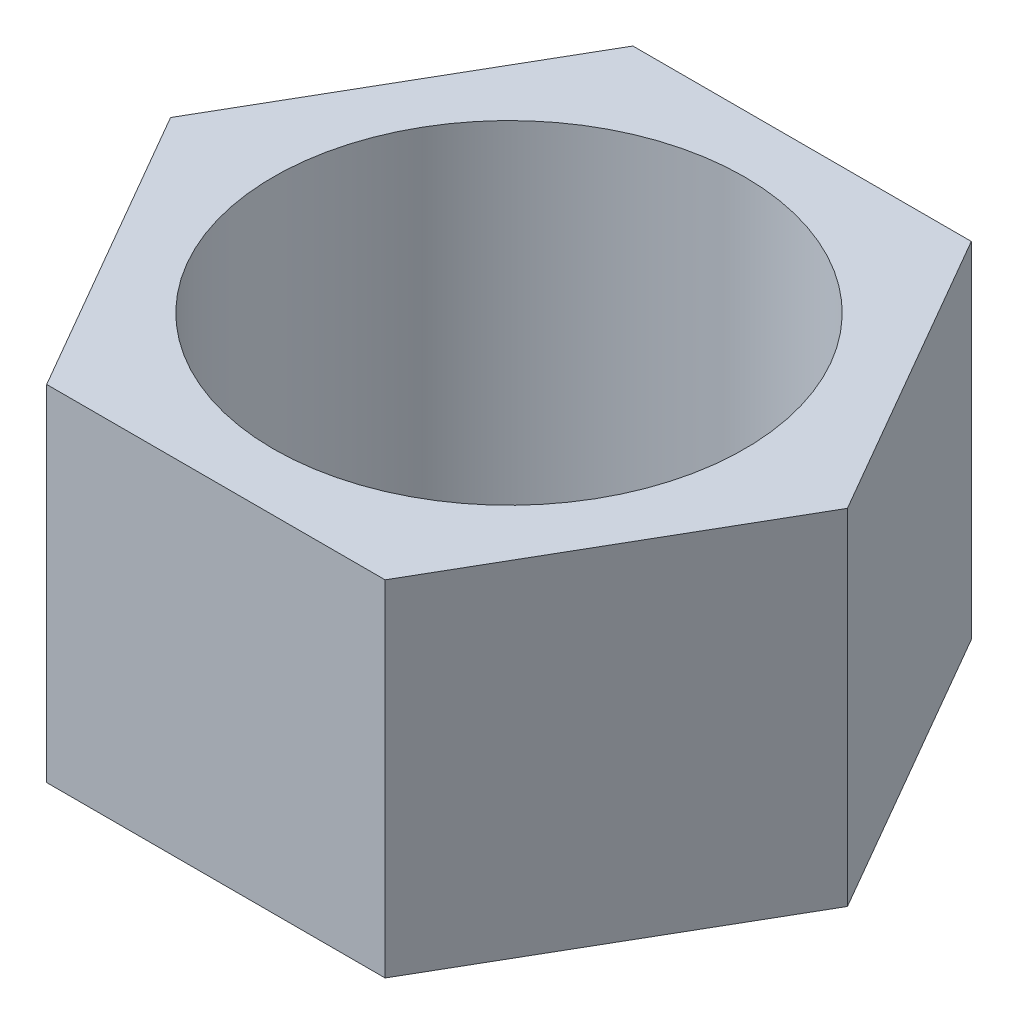
ISO-10303-21;
HEADER;
FILE_DESCRIPTION(('STEP AP214'),'2;1');
FILE_NAME('part.step','',(''),(''),'','','');
FILE_SCHEMA(('AUTOMOTIVE_DESIGN { 1 0 10303 214 1 1 1 1 }'));
ENDSEC;
DATA;
#1=APPLICATION_CONTEXT('core data for automotive mechanical design processes');
#2=APPLICATION_PROTOCOL_DEFINITION('international standard','automotive_design',2000,#1);
#3=PRODUCT_CONTEXT('',#1,'mechanical');
#4=PRODUCT('Part','Part','',(#3));
#5=PRODUCT_RELATED_PRODUCT_CATEGORY('part','',(#4));
#6=PRODUCT_DEFINITION_FORMATION('','',#4);
#7=PRODUCT_DEFINITION_CONTEXT('part definition',#1,'design');
#8=PRODUCT_DEFINITION('design','',#6,#7);
#9=PRODUCT_DEFINITION_SHAPE('','',#8);
#10=(LENGTH_UNIT() NAMED_UNIT(*) SI_UNIT(.MILLI.,.METRE.));
#11=(NAMED_UNIT(*) PLANE_ANGLE_UNIT() SI_UNIT($,.RADIAN.));
#12=(NAMED_UNIT(*) SI_UNIT($,.STERADIAN.) SOLID_ANGLE_UNIT());
#13=UNCERTAINTY_MEASURE_WITH_UNIT(LENGTH_MEASURE(1.E-05),#10,'distance_accuracy_value','');
#14=(GEOMETRIC_REPRESENTATION_CONTEXT(3) GLOBAL_UNCERTAINTY_ASSIGNED_CONTEXT((#13)) GLOBAL_UNIT_ASSIGNED_CONTEXT((#10,
#11,#12)) REPRESENTATION_CONTEXT('',''));
#15=CARTESIAN_POINT('',(0.,0.,0.));
#16=DIRECTION('',(0.,0.,1.));
#17=DIRECTION('',(1.,0.,0.));
#18=AXIS2_PLACEMENT_3D('',#15,#16,#17);
#19=CARTESIAN_POINT('',(0.,7.61999999999996,0.));
#20=DIRECTION('',(0.,1.,0.));
#21=DIRECTION('',(0.,0.,1.));
#22=AXIS2_PLACEMENT_3D('',#19,#20,#21);
#23=PLANE('',#22);
#24=DIRECTION('',(0.5,0.,-0.866025403784439));
#25=VECTOR('',#24,1.);
#26=CARTESIAN_POINT('',(3.7394976935412,7.61999999999996,6.47700000000007));
#27=LINE('',#26,#25);
#28=CARTESIAN_POINT('',(3.7394976935412,7.61999999999996,6.47700000000007));
#29=VERTEX_POINT('',#28);
#30=CARTESIAN_POINT('',(7.47899538708241,7.61999999999996,0.));
#31=VERTEX_POINT('',#30);
#32=EDGE_CURVE('E294',#29,#31,#27,.T.);
#33=ORIENTED_EDGE('',*,*,#32,.T.);
#34=DIRECTION('',(-0.5,0.,-0.866025403784438));
#35=VECTOR('',#34,1.);
#36=CARTESIAN_POINT('',(7.47899538708241,7.61999999999996,0.));
#37=LINE('',#36,#35);
#38=CARTESIAN_POINT('',(3.7394976935412,7.61999999999996,-6.47700000000007));
#39=VERTEX_POINT('',#38);
#40=EDGE_CURVE('E241',#31,#39,#37,.T.);
#41=ORIENTED_EDGE('',*,*,#40,.T.);
#42=DIRECTION('',(-1.,0.,0.));
#43=VECTOR('',#42,1.);
#44=CARTESIAN_POINT('',(3.7394976935412,7.61999999999996,-6.47700000000007));
#45=LINE('',#44,#43);
#46=CARTESIAN_POINT('',(-3.7394976935412,7.61999999999996,-6.47700000000007));
#47=VERTEX_POINT('',#46);
#48=EDGE_CURVE('E253',#39,#47,#45,.T.);
#49=ORIENTED_EDGE('',*,*,#48,.T.);
#50=DIRECTION('',(-0.5,0.,0.866025403784439));
#51=VECTOR('',#50,1.);
#52=CARTESIAN_POINT('',(-3.7394976935412,7.61999999999996,-6.47700000000007));
#53=LINE('',#52,#51);
#54=CARTESIAN_POINT('',(-7.47899538708241,7.61999999999996,0.));
#55=VERTEX_POINT('',#54);
#56=EDGE_CURVE('E246',#47,#55,#53,.T.);
#57=ORIENTED_EDGE('',*,*,#56,.T.);
#58=DIRECTION('',(0.5,0.,0.866025403784439));
#59=VECTOR('',#58,1.);
#60=CARTESIAN_POINT('',(-7.47899538708241,7.61999999999996,0.));
#61=LINE('',#60,#59);
#62=CARTESIAN_POINT('',(-3.7394976935412,7.61999999999996,6.47700000000007));
#63=VERTEX_POINT('',#62);
#64=EDGE_CURVE('E252',#55,#63,#61,.T.);
#65=ORIENTED_EDGE('',*,*,#64,.T.);
#66=DIRECTION('',(1.,0.,0.));
#67=VECTOR('',#66,1.);
#68=CARTESIAN_POINT('',(-3.7394976935412,7.61999999999996,6.47700000000007));
#69=LINE('',#68,#67);
#70=EDGE_CURVE('E204',#63,#29,#69,.T.);
#71=ORIENTED_EDGE('',*,*,#70,.T.);
#72=EDGE_LOOP('',(#33,#41,#49,#57,#65,#71));
#73=FACE_BOUND('',#72,.T.);
#74=CARTESIAN_POINT('',(0.,7.61999999999996,0.));
#75=DIRECTION('',(0.,1.,0.));
#76=DIRECTION('',(0.,0.,1.));
#77=AXIS2_PLACEMENT_3D('',#74,#75,#76);
#78=CIRCLE('',#77,5.207);
#79=CARTESIAN_POINT('',(0.,7.61999999999996,-5.207));
#80=VERTEX_POINT('',#79);
#81=EDGE_CURVE('E285',#80,#80,#78,.T.);
#82=ORIENTED_EDGE('',*,*,#81,.F.);
#83=EDGE_LOOP('',(#82));
#84=FACE_BOUND('',#83,.T.);
#85=ADVANCED_FACE('F186',(#73,#84),#23,.T.);
#86=CARTESIAN_POINT('',(0.,0.,0.));
#87=DIRECTION('',(0.,1.,0.));
#88=DIRECTION('',(0.,0.,1.));
#89=AXIS2_PLACEMENT_3D('',#86,#87,#88);
#90=PLANE('',#89);
#91=DIRECTION('',(0.5,0.,-0.866025403784439));
#92=VECTOR('',#91,1.);
#93=CARTESIAN_POINT('',(3.7394976935412,0.,6.47700000000007));
#94=LINE('',#93,#92);
#95=CARTESIAN_POINT('',(3.7394976935412,0.,6.47700000000007));
#96=VERTEX_POINT('',#95);
#97=CARTESIAN_POINT('',(7.47899538708241,0.,0.));
#98=VERTEX_POINT('',#97);
#99=EDGE_CURVE('E280',#96,#98,#94,.T.);
#100=ORIENTED_EDGE('',*,*,#99,.F.);
#101=DIRECTION('',(1.,0.,0.));
#102=VECTOR('',#101,1.);
#103=CARTESIAN_POINT('',(-3.7394976935412,0.,6.47700000000007));
#104=LINE('',#103,#102);
#105=CARTESIAN_POINT('',(-3.7394976935412,0.,6.47700000000007));
#106=VERTEX_POINT('',#105);
#107=EDGE_CURVE('E232',#106,#96,#104,.T.);
#108=ORIENTED_EDGE('',*,*,#107,.F.);
#109=DIRECTION('',(0.5,0.,0.866025403784439));
#110=VECTOR('',#109,1.);
#111=CARTESIAN_POINT('',(-7.47899538708241,0.,0.));
#112=LINE('',#111,#110);
#113=CARTESIAN_POINT('',(-7.47899538708241,0.,0.));
#114=VERTEX_POINT('',#113);
#115=EDGE_CURVE('E230',#114,#106,#112,.T.);
#116=ORIENTED_EDGE('',*,*,#115,.F.);
#117=DIRECTION('',(-0.5,0.,0.866025403784439));
#118=VECTOR('',#117,1.);
#119=CARTESIAN_POINT('',(-3.7394976935412,0.,-6.47700000000007));
#120=LINE('',#119,#118);
#121=CARTESIAN_POINT('',(-3.7394976935412,0.,-6.47700000000007));
#122=VERTEX_POINT('',#121);
#123=EDGE_CURVE('E261',#122,#114,#120,.T.);
#124=ORIENTED_EDGE('',*,*,#123,.F.);
#125=DIRECTION('',(-1.,0.,0.));
#126=VECTOR('',#125,1.);
#127=CARTESIAN_POINT('',(3.7394976935412,0.,-6.47700000000007));
#128=LINE('',#127,#126);
#129=CARTESIAN_POINT('',(3.7394976935412,0.,-6.47700000000007));
#130=VERTEX_POINT('',#129);
#131=EDGE_CURVE('E283',#130,#122,#128,.T.);
#132=ORIENTED_EDGE('',*,*,#131,.F.);
#133=DIRECTION('',(-0.5,0.,-0.866025403784438));
#134=VECTOR('',#133,1.);
#135=CARTESIAN_POINT('',(7.47899538708241,0.,0.));
#136=LINE('',#135,#134);
#137=EDGE_CURVE('E282',#98,#130,#136,.T.);
#138=ORIENTED_EDGE('',*,*,#137,.F.);
#139=EDGE_LOOP('',(#100,#108,#116,#124,#132,#138));
#140=FACE_BOUND('',#139,.T.);
#141=CARTESIAN_POINT('',(0.,0.,0.));
#142=DIRECTION('',(0.,1.,0.));
#143=DIRECTION('',(0.,0.,1.));
#144=AXIS2_PLACEMENT_3D('',#141,#142,#143);
#145=CIRCLE('',#144,5.207);
#146=CARTESIAN_POINT('',(0.,0.,-5.207));
#147=VERTEX_POINT('',#146);
#148=EDGE_CURVE('E371',#147,#147,#145,.T.);
#149=ORIENTED_EDGE('',*,*,#148,.T.);
#150=EDGE_LOOP('',(#149));
#151=FACE_BOUND('',#150,.T.);
#152=ADVANCED_FACE('F306',(#140,#151),#90,.F.);
#153=CARTESIAN_POINT('',(3.7394976935412,7.61999999999996,6.47700000000007));
#154=DIRECTION('',(-0.866025403784439,0.,-0.5));
#155=DIRECTION('',(-0.5,0.,0.866025403784439));
#156=AXIS2_PLACEMENT_3D('',#153,#154,#155);
#157=PLANE('',#156);
#158=ORIENTED_EDGE('',*,*,#99,.T.);
#159=DIRECTION('',(0.,-1.,0.));
#160=VECTOR('',#159,1.);
#161=CARTESIAN_POINT('',(7.47899538708241,7.61999999999996,0.));
#162=LINE('',#161,#160);
#163=EDGE_CURVE('E12',#31,#98,#162,.T.);
#164=ORIENTED_EDGE('',*,*,#163,.F.);
#165=ORIENTED_EDGE('',*,*,#32,.F.);
#166=DIRECTION('',(0.,-1.,0.));
#167=VECTOR('',#166,1.);
#168=CARTESIAN_POINT('',(3.7394976935412,7.61999999999996,6.47700000000007));
#169=LINE('',#168,#167);
#170=EDGE_CURVE('E273',#29,#96,#169,.T.);
#171=ORIENTED_EDGE('',*,*,#170,.T.);
#172=EDGE_LOOP('',(#158,#164,#165,#171));
#173=FACE_BOUND('',#172,.T.);
#174=ADVANCED_FACE('F187',(#173),#157,.F.);
#175=CARTESIAN_POINT('',(7.47899538708241,7.61999999999996,0.));
#176=DIRECTION('',(-0.866025403784439,0.,0.5));
#177=DIRECTION('',(0.5,0.,0.866025403784439));
#178=AXIS2_PLACEMENT_3D('',#175,#176,#177);
#179=PLANE('',#178);
#180=ORIENTED_EDGE('',*,*,#137,.T.);
#181=DIRECTION('',(0.,-1.,0.));
#182=VECTOR('',#181,1.);
#183=CARTESIAN_POINT('',(3.7394976935412,7.61999999999996,-6.47700000000007));
#184=LINE('',#183,#182);
#185=EDGE_CURVE('E196',#39,#130,#184,.T.);
#186=ORIENTED_EDGE('',*,*,#185,.F.);
#187=ORIENTED_EDGE('',*,*,#40,.F.);
#188=ORIENTED_EDGE('',*,*,#163,.T.);
#189=EDGE_LOOP('',(#180,#186,#187,#188));
#190=FACE_BOUND('',#189,.T.);
#191=ADVANCED_FACE('F337',(#190),#179,.F.);
#192=CARTESIAN_POINT('',(3.7394976935412,7.61999999999996,-6.47700000000007));
#193=DIRECTION('',(0.,0.,1.));
#194=DIRECTION('',(1.,0.,0.));
#195=AXIS2_PLACEMENT_3D('',#192,#193,#194);
#196=PLANE('',#195);
#197=ORIENTED_EDGE('',*,*,#131,.T.);
#198=DIRECTION('',(0.,-1.,0.));
#199=VECTOR('',#198,1.);
#200=CARTESIAN_POINT('',(-3.7394976935412,7.61999999999996,-6.47700000000007));
#201=LINE('',#200,#199);
#202=EDGE_CURVE('E262',#47,#122,#201,.T.);
#203=ORIENTED_EDGE('',*,*,#202,.F.);
#204=ORIENTED_EDGE('',*,*,#48,.F.);
#205=ORIENTED_EDGE('',*,*,#185,.T.);
#206=EDGE_LOOP('',(#197,#203,#204,#205));
#207=FACE_BOUND('',#206,.T.);
#208=ADVANCED_FACE('F304',(#207),#196,.F.);
#209=CARTESIAN_POINT('',(-3.7394976935412,7.61999999999996,-6.47700000000007));
#210=DIRECTION('',(0.866025403784438,0.,0.5));
#211=DIRECTION('',(0.5,0.,-0.866025403784439));
#212=AXIS2_PLACEMENT_3D('',#209,#210,#211);
#213=PLANE('',#212);
#214=ORIENTED_EDGE('',*,*,#123,.T.);
#215=DIRECTION('',(0.,-1.,0.));
#216=VECTOR('',#215,1.);
#217=CARTESIAN_POINT('',(-7.47899538708241,7.61999999999996,0.));
#218=LINE('',#217,#216);
#219=EDGE_CURVE('E259',#55,#114,#218,.T.);
#220=ORIENTED_EDGE('',*,*,#219,.F.);
#221=ORIENTED_EDGE('',*,*,#56,.F.);
#222=ORIENTED_EDGE('',*,*,#202,.T.);
#223=EDGE_LOOP('',(#214,#220,#221,#222));
#224=FACE_BOUND('',#223,.T.);
#225=ADVANCED_FACE('F263',(#224),#213,.F.);
#226=CARTESIAN_POINT('',(-7.47899538708241,7.61999999999996,0.));
#227=DIRECTION('',(0.866025403784439,0.,-0.5));
#228=DIRECTION('',(-0.5,0.,-0.866025403784439));
#229=AXIS2_PLACEMENT_3D('',#226,#227,#228);
#230=PLANE('',#229);
#231=ORIENTED_EDGE('',*,*,#115,.T.);
#232=DIRECTION('',(0.,-1.,0.));
#233=VECTOR('',#232,1.);
#234=CARTESIAN_POINT('',(-3.7394976935412,7.61999999999996,6.47700000000007));
#235=LINE('',#234,#233);
#236=EDGE_CURVE('E266',#63,#106,#235,.T.);
#237=ORIENTED_EDGE('',*,*,#236,.F.);
#238=ORIENTED_EDGE('',*,*,#64,.F.);
#239=ORIENTED_EDGE('',*,*,#219,.T.);
#240=EDGE_LOOP('',(#231,#237,#238,#239));
#241=FACE_BOUND('',#240,.T.);
#242=ADVANCED_FACE('F268',(#241),#230,.F.);
#243=CARTESIAN_POINT('',(-3.7394976935412,7.61999999999996,6.47700000000007));
#244=DIRECTION('',(0.,0.,-1.));
#245=DIRECTION('',(-1.,0.,0.));
#246=AXIS2_PLACEMENT_3D('',#243,#244,#245);
#247=PLANE('',#246);
#248=ORIENTED_EDGE('',*,*,#107,.T.);
#249=ORIENTED_EDGE('',*,*,#170,.F.);
#250=ORIENTED_EDGE('',*,*,#70,.F.);
#251=ORIENTED_EDGE('',*,*,#236,.T.);
#252=EDGE_LOOP('',(#248,#249,#250,#251));
#253=FACE_BOUND('',#252,.T.);
#254=ADVANCED_FACE('F313',(#253),#247,.F.);
#255=CARTESIAN_POINT('',(0.,7.61999999999996,0.));
#256=DIRECTION('',(0.,-1.,0.));
#257=DIRECTION('',(0.,0.,-1.));
#258=AXIS2_PLACEMENT_3D('',#255,#256,#257);
#259=CYLINDRICAL_SURFACE('',#258,5.207);
#260=CARTESIAN_POINT('',(0.,7.61999999999996,-5.207));
#261=CARTESIAN_POINT('',(0.,7.54062499999996,-5.207));
#262=CARTESIAN_POINT('',(0.,7.46124999999996,-5.207));
#263=CARTESIAN_POINT('',(0.,7.30249999999996,-5.207));
#264=CARTESIAN_POINT('',(0.,7.22312499999996,-5.207));
#265=CARTESIAN_POINT('',(0.,7.06437499999996,-5.207));
#266=CARTESIAN_POINT('',(0.,6.98499999999996,-5.207));
#267=CARTESIAN_POINT('',(0.,6.82624999999996,-5.207));
#268=CARTESIAN_POINT('',(0.,6.74687499999996,-5.207));
#269=CARTESIAN_POINT('',(0.,6.58812499999997,-5.207));
#270=CARTESIAN_POINT('',(0.,6.50874999999997,-5.207));
#271=CARTESIAN_POINT('',(0.,6.34999999999997,-5.207));
#272=CARTESIAN_POINT('',(0.,6.27062499999997,-5.207));
#273=CARTESIAN_POINT('',(0.,6.11187499999997,-5.207));
#274=CARTESIAN_POINT('',(0.,6.03249999999997,-5.207));
#275=CARTESIAN_POINT('',(0.,5.87374999999997,-5.207));
#276=CARTESIAN_POINT('',(0.,5.79437499999997,-5.207));
#277=CARTESIAN_POINT('',(0.,5.63562499999997,-5.207));
#278=CARTESIAN_POINT('',(0.,5.55624999999997,-5.207));
#279=CARTESIAN_POINT('',(0.,5.39749999999997,-5.207));
#280=CARTESIAN_POINT('',(0.,5.31812499999997,-5.207));
#281=CARTESIAN_POINT('',(0.,5.15937499999997,-5.207));
#282=CARTESIAN_POINT('',(0.,5.07999999999997,-5.207));
#283=CARTESIAN_POINT('',(0.,4.92124999999997,-5.207));
#284=CARTESIAN_POINT('',(0.,4.84187499999998,-5.207));
#285=CARTESIAN_POINT('',(0.,4.68312499999998,-5.207));
#286=CARTESIAN_POINT('',(0.,4.60374999999998,-5.207));
#287=CARTESIAN_POINT('',(0.,4.44499999999998,-5.207));
#288=CARTESIAN_POINT('',(0.,4.36562499999998,-5.207));
#289=CARTESIAN_POINT('',(0.,4.20687499999998,-5.207));
#290=CARTESIAN_POINT('',(0.,4.12749999999998,-5.207));
#291=CARTESIAN_POINT('',(0.,3.96874999999998,-5.207));
#292=CARTESIAN_POINT('',(0.,3.88937499999998,-5.207));
#293=CARTESIAN_POINT('',(0.,3.73062499999998,-5.207));
#294=CARTESIAN_POINT('',(0.,3.65124999999998,-5.207));
#295=CARTESIAN_POINT('',(0.,3.49249999999998,-5.207));
#296=CARTESIAN_POINT('',(0.,3.41312499999998,-5.207));
#297=CARTESIAN_POINT('',(0.,3.25437499999998,-5.207));
#298=CARTESIAN_POINT('',(0.,3.17499999999998,-5.207));
#299=CARTESIAN_POINT('',(0.,3.01624999999998,-5.207));
#300=CARTESIAN_POINT('',(0.,2.93687499999998,-5.207));
#301=CARTESIAN_POINT('',(0.,2.77812499999998,-5.207));
#302=CARTESIAN_POINT('',(0.,2.69874999999998,-5.207));
#303=CARTESIAN_POINT('',(0.,2.53999999999999,-5.207));
#304=CARTESIAN_POINT('',(0.,2.46062499999999,-5.207));
#305=CARTESIAN_POINT('',(0.,2.30187499999999,-5.207));
#306=CARTESIAN_POINT('',(0.,2.22249999999999,-5.207));
#307=CARTESIAN_POINT('',(0.,2.06374999999999,-5.207));
#308=CARTESIAN_POINT('',(0.,1.98437499999999,-5.207));
#309=CARTESIAN_POINT('',(0.,1.82562499999999,-5.207));
#310=CARTESIAN_POINT('',(0.,1.74624999999999,-5.207));
#311=CARTESIAN_POINT('',(0.,1.58749999999999,-5.207));
#312=CARTESIAN_POINT('',(0.,1.50812499999999,-5.207));
#313=CARTESIAN_POINT('',(0.,1.34937499999999,-5.207));
#314=CARTESIAN_POINT('',(0.,1.26999999999999,-5.207));
#315=CARTESIAN_POINT('',(0.,1.11124999999999,-5.207));
#316=CARTESIAN_POINT('',(0.,1.03187499999999,-5.207));
#317=CARTESIAN_POINT('',(0.,0.873124999999995,-5.207));
#318=CARTESIAN_POINT('',(0.,0.793749999999995,-5.207));
#319=CARTESIAN_POINT('',(0.,0.634999999999996,-5.207));
#320=CARTESIAN_POINT('',(0.,0.555624999999996,-5.207));
#321=CARTESIAN_POINT('',(0.,0.396874999999997,-5.207));
#322=CARTESIAN_POINT('',(0.,0.317499999999997,-5.207));
#323=CARTESIAN_POINT('',(0.,0.158749999999998,-5.207));
#324=CARTESIAN_POINT('',(0.,0.0793749999999987,-5.207));
#325=CARTESIAN_POINT('',(0.,0.,-5.207));
#326=B_SPLINE_CURVE_WITH_KNOTS('',3,(#260,#261,#262,#263,#264,#265,#266,#267,#268,#269,#270,
#271,#272,#273,#274,#275,#276,#277,#278,#279,#280,#281,#282,#283,#284,#285,#286,#287,#288,#289,
#290,#291,#292,#293,#294,#295,#296,#297,#298,#299,#300,#301,#302,#303,#304,#305,#306,#307,#308,
#309,#310,#311,#312,#313,#314,#315,#316,#317,#318,#319,#320,#321,#322,#323,#324,#325),
.UNSPECIFIED.,.F.,.F.,(4,2,2,2,2,2,2,2,2,2,2,2,2,2,2,2,2,2,2,2,2,2,2,2,2,2,2,2,2,2,2,2,4),(0.,
0.238124999999998,0.476249999999997,0.714374999999995,0.952499999999994,1.19062499999999,
1.42874999999999,1.66687499999999,1.90499999999999,2.14312499999999,2.38124999999999,
2.61937499999999,2.85749999999998,3.09562499999998,3.33374999999998,3.57187499999998,
3.80999999999998,4.04812499999998,4.28624999999998,4.52437499999998,4.76249999999998,
5.00062499999997,5.23874999999997,5.47687499999997,5.71499999999997,5.95312499999997,
6.19124999999997,6.42937499999997,6.66749999999996,6.90562499999996,7.14374999999996,
7.38187499999996,7.61999999999996),.UNSPECIFIED.);
#327=EDGE_CURVE('BSEAM314',#80,#147,#326,.T.);
#328=ORIENTED_EDGE('',*,*,#81,.T.);
#329=ORIENTED_EDGE('',*,*,#148,.F.);
#330=ORIENTED_EDGE('',*,*,#327,.T.);
#331=ORIENTED_EDGE('',*,*,#327,.F.);
#332=EDGE_LOOP('',(#328,#330,#329,#331));
#333=FACE_BOUND('',#332,.T.);
#334=ADVANCED_FACE('F314',(#333),#259,.F.);
#335=CLOSED_SHELL('',(#85,#152,#174,#191,#208,#225,#242,#254,#334));
#336=MANIFOLD_SOLID_BREP('B2',#335);
#337=ADVANCED_BREP_SHAPE_REPRESENTATION('',(#18,#336),#14);
#338=SHAPE_DEFINITION_REPRESENTATION(#9,#337);
ENDSEC;
END-ISO-10303-21;
